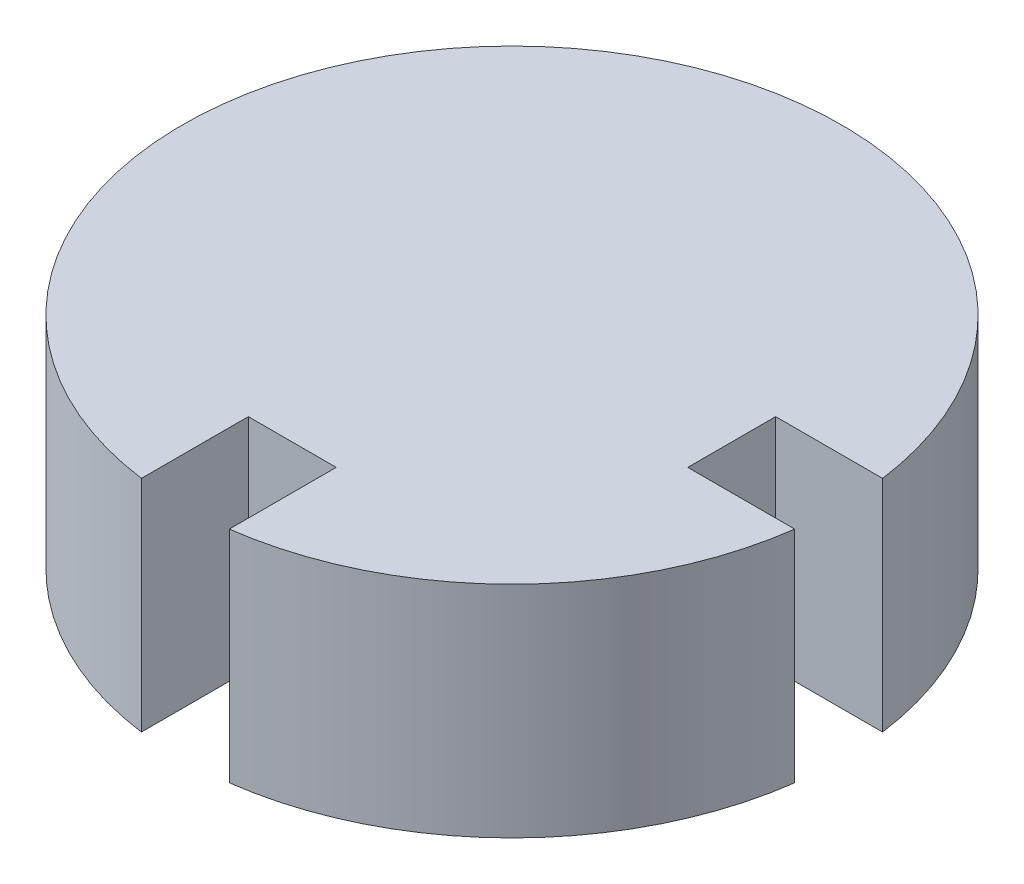
ISO-10303-21;
HEADER;
FILE_DESCRIPTION(('STEP AP214'),'2;1');
FILE_NAME('part.step','',(''),(''),'','','');
FILE_SCHEMA(('AUTOMOTIVE_DESIGN { 1 0 10303 214 1 1 1 1 }'));
ENDSEC;
DATA;
#1=APPLICATION_CONTEXT('core data for automotive mechanical design processes');
#2=APPLICATION_PROTOCOL_DEFINITION('international standard','automotive_design',2000,#1);
#3=PRODUCT_CONTEXT('',#1,'mechanical');
#4=PRODUCT('Part','Part','',(#3));
#5=PRODUCT_RELATED_PRODUCT_CATEGORY('part','',(#4));
#6=PRODUCT_DEFINITION_FORMATION('','',#4);
#7=PRODUCT_DEFINITION_CONTEXT('part definition',#1,'design');
#8=PRODUCT_DEFINITION('design','',#6,#7);
#9=PRODUCT_DEFINITION_SHAPE('','',#8);
#10=(LENGTH_UNIT() NAMED_UNIT(*) SI_UNIT(.MILLI.,.METRE.));
#11=(NAMED_UNIT(*) PLANE_ANGLE_UNIT() SI_UNIT($,.RADIAN.));
#12=(NAMED_UNIT(*) SI_UNIT($,.STERADIAN.) SOLID_ANGLE_UNIT());
#13=UNCERTAINTY_MEASURE_WITH_UNIT(LENGTH_MEASURE(1.E-05),#10,'distance_accuracy_value','');
#14=(GEOMETRIC_REPRESENTATION_CONTEXT(3) GLOBAL_UNCERTAINTY_ASSIGNED_CONTEXT((#13)) GLOBAL_UNIT_ASSIGNED_CONTEXT((#10,
#11,#12)) REPRESENTATION_CONTEXT('',''));
#15=CARTESIAN_POINT('',(0.,0.,0.));
#16=DIRECTION('',(0.,0.,1.));
#17=DIRECTION('',(1.,0.,0.));
#18=AXIS2_PLACEMENT_3D('',#15,#16,#17);
#19=CARTESIAN_POINT('',(0.4,2.,0.));
#20=DIRECTION('',(-1.,0.,0.));
#21=DIRECTION('',(0.,0.,1.));
#22=AXIS2_PLACEMENT_3D('',#19,#20,#21);
#23=PLANE('',#22);
#24=DIRECTION('',(0.,0.,-1.));
#25=VECTOR('',#24,1.);
#26=CARTESIAN_POINT('',(0.4,0.,0.));
#27=LINE('',#26,#25);
#28=CARTESIAN_POINT('',(0.4,0.,2.9732137494637));
#29=VERTEX_POINT('',#28);
#30=CARTESIAN_POINT('',(0.4,0.,2.));
#31=VERTEX_POINT('',#30);
#32=EDGE_CURVE('E140',#29,#31,#27,.T.);
#33=ORIENTED_EDGE('',*,*,#32,.F.);
#34=DIRECTION('',(0.,-1.,0.));
#35=VECTOR('',#34,1.);
#36=CARTESIAN_POINT('',(0.4,2.,2.9732137494637));
#37=LINE('',#36,#35);
#38=CARTESIAN_POINT('',(0.4,2.,2.9732137494637));
#39=VERTEX_POINT('',#38);
#40=EDGE_CURVE('E11',#39,#29,#37,.T.);
#41=ORIENTED_EDGE('',*,*,#40,.F.);
#42=DIRECTION('',(0.,0.,-1.));
#43=VECTOR('',#42,1.);
#44=CARTESIAN_POINT('',(0.4,2.,0.));
#45=LINE('',#44,#43);
#46=CARTESIAN_POINT('',(0.4,2.,2.));
#47=VERTEX_POINT('',#46);
#48=EDGE_CURVE('E163',#39,#47,#45,.T.);
#49=ORIENTED_EDGE('',*,*,#48,.T.);
#50=DIRECTION('',(0.,-1.,0.));
#51=VECTOR('',#50,1.);
#52=CARTESIAN_POINT('',(0.4,2.,2.));
#53=LINE('',#52,#51);
#54=EDGE_CURVE('E93',#47,#31,#53,.T.);
#55=ORIENTED_EDGE('',*,*,#54,.T.);
#56=EDGE_LOOP('',(#33,#41,#49,#55));
#57=FACE_BOUND('',#56,.T.);
#58=ADVANCED_FACE('F41',(#57),#23,.T.);
#59=CARTESIAN_POINT('',(0.,2.,0.));
#60=DIRECTION('',(0.,-1.,0.));
#61=DIRECTION('',(0.,0.,-1.));
#62=AXIS2_PLACEMENT_3D('',#59,#60,#61);
#63=CYLINDRICAL_SURFACE('',#62,3.);
#64=CARTESIAN_POINT('',(0.,0.,0.));
#65=DIRECTION('',(0.,1.,0.));
#66=DIRECTION('',(0.,0.,1.));
#67=AXIS2_PLACEMENT_3D('',#64,#65,#66);
#68=CIRCLE('',#67,3.);
#69=CARTESIAN_POINT('',(2.9732137494637,0.,0.4));
#70=VERTEX_POINT('',#69);
#71=EDGE_CURVE('E144',#29,#70,#68,.T.);
#72=ORIENTED_EDGE('',*,*,#71,.T.);
#73=DIRECTION('',(0.,-1.,0.));
#74=VECTOR('',#73,1.);
#75=CARTESIAN_POINT('',(2.9732137494637,2.,0.4));
#76=LINE('',#75,#74);
#77=CARTESIAN_POINT('',(2.9732137494637,2.,0.4));
#78=VERTEX_POINT('',#77);
#79=EDGE_CURVE('E50',#78,#70,#76,.T.);
#80=ORIENTED_EDGE('',*,*,#79,.F.);
#81=CARTESIAN_POINT('',(0.,2.,0.));
#82=DIRECTION('',(0.,1.,0.));
#83=DIRECTION('',(0.,0.,1.));
#84=AXIS2_PLACEMENT_3D('',#81,#82,#83);
#85=CIRCLE('',#84,3.);
#86=EDGE_CURVE('E123',#39,#78,#85,.T.);
#87=ORIENTED_EDGE('',*,*,#86,.F.);
#88=ORIENTED_EDGE('',*,*,#40,.T.);
#89=EDGE_LOOP('',(#72,#80,#87,#88));
#90=FACE_BOUND('',#89,.T.);
#91=ADVANCED_FACE('F203',(#90),#63,.T.);
#92=CARTESIAN_POINT('',(0.,2.,0.4));
#93=DIRECTION('',(0.,0.,1.));
#94=DIRECTION('',(1.,0.,0.));
#95=AXIS2_PLACEMENT_3D('',#92,#93,#94);
#96=PLANE('',#95);
#97=DIRECTION('',(-1.,0.,0.));
#98=VECTOR('',#97,1.);
#99=CARTESIAN_POINT('',(0.,0.,0.4));
#100=LINE('',#99,#98);
#101=CARTESIAN_POINT('',(2.,0.,0.4));
#102=VERTEX_POINT('',#101);
#103=EDGE_CURVE('E147',#70,#102,#100,.T.);
#104=ORIENTED_EDGE('',*,*,#103,.T.);
#105=DIRECTION('',(0.,-1.,0.));
#106=VECTOR('',#105,1.);
#107=CARTESIAN_POINT('',(2.,2.,0.4));
#108=LINE('',#107,#106);
#109=CARTESIAN_POINT('',(2.,2.,0.4));
#110=VERTEX_POINT('',#109);
#111=EDGE_CURVE('E173',#110,#102,#108,.T.);
#112=ORIENTED_EDGE('',*,*,#111,.F.);
#113=DIRECTION('',(-1.,0.,0.));
#114=VECTOR('',#113,1.);
#115=CARTESIAN_POINT('',(0.,2.,0.4));
#116=LINE('',#115,#114);
#117=EDGE_CURVE('E184',#78,#110,#116,.T.);
#118=ORIENTED_EDGE('',*,*,#117,.F.);
#119=ORIENTED_EDGE('',*,*,#79,.T.);
#120=EDGE_LOOP('',(#104,#112,#118,#119));
#121=FACE_BOUND('',#120,.T.);
#122=ADVANCED_FACE('F182',(#121),#96,.F.);
#123=CARTESIAN_POINT('',(2.,2.,0.));
#124=DIRECTION('',(-1.,0.,0.));
#125=DIRECTION('',(0.,0.,1.));
#126=AXIS2_PLACEMENT_3D('',#123,#124,#125);
#127=PLANE('',#126);
#128=DIRECTION('',(0.,0.,-1.));
#129=VECTOR('',#128,1.);
#130=CARTESIAN_POINT('',(2.,0.,0.));
#131=LINE('',#130,#129);
#132=CARTESIAN_POINT('',(2.,0.,-0.4));
#133=VERTEX_POINT('',#132);
#134=EDGE_CURVE('E150',#102,#133,#131,.T.);
#135=ORIENTED_EDGE('',*,*,#134,.T.);
#136=DIRECTION('',(0.,-1.,0.));
#137=VECTOR('',#136,1.);
#138=CARTESIAN_POINT('',(2.,2.,-0.4));
#139=LINE('',#138,#137);
#140=CARTESIAN_POINT('',(2.,2.,-0.4));
#141=VERTEX_POINT('',#140);
#142=EDGE_CURVE('E170',#141,#133,#139,.T.);
#143=ORIENTED_EDGE('',*,*,#142,.F.);
#144=DIRECTION('',(0.,0.,-1.));
#145=VECTOR('',#144,1.);
#146=CARTESIAN_POINT('',(2.,2.,0.));
#147=LINE('',#146,#145);
#148=EDGE_CURVE('E195',#110,#141,#147,.T.);
#149=ORIENTED_EDGE('',*,*,#148,.F.);
#150=ORIENTED_EDGE('',*,*,#111,.T.);
#151=EDGE_LOOP('',(#135,#143,#149,#150));
#152=FACE_BOUND('',#151,.T.);
#153=ADVANCED_FACE('F193',(#152),#127,.F.);
#154=CARTESIAN_POINT('',(0.,2.,-0.399999999999999));
#155=DIRECTION('',(0.,0.,1.));
#156=DIRECTION('',(1.,0.,0.));
#157=AXIS2_PLACEMENT_3D('',#154,#155,#156);
#158=PLANE('',#157);
#159=DIRECTION('',(-1.,0.,0.));
#160=VECTOR('',#159,1.);
#161=CARTESIAN_POINT('',(0.,0.,-0.399999999999999));
#162=LINE('',#161,#160);
#163=CARTESIAN_POINT('',(2.9732137494637,0.,-0.4));
#164=VERTEX_POINT('',#163);
#165=EDGE_CURVE('E154',#164,#133,#162,.T.);
#166=ORIENTED_EDGE('',*,*,#165,.F.);
#167=DIRECTION('',(0.,-1.,0.));
#168=VECTOR('',#167,1.);
#169=CARTESIAN_POINT('',(2.9732137494637,2.,-0.4));
#170=LINE('',#169,#168);
#171=CARTESIAN_POINT('',(2.9732137494637,2.,-0.4));
#172=VERTEX_POINT('',#171);
#173=EDGE_CURVE('E129',#172,#164,#170,.T.);
#174=ORIENTED_EDGE('',*,*,#173,.F.);
#175=DIRECTION('',(-1.,0.,0.));
#176=VECTOR('',#175,1.);
#177=CARTESIAN_POINT('',(0.,2.,-0.399999999999999));
#178=LINE('',#177,#176);
#179=EDGE_CURVE('E119',#172,#141,#178,.T.);
#180=ORIENTED_EDGE('',*,*,#179,.T.);
#181=ORIENTED_EDGE('',*,*,#142,.T.);
#182=EDGE_LOOP('',(#166,#174,#180,#181));
#183=FACE_BOUND('',#182,.T.);
#184=ADVANCED_FACE('F213',(#183),#158,.T.);
#185=CARTESIAN_POINT('',(-0.4,0.,2.9732137494637));
#186=VERTEX_POINT('',#185);
#187=EDGE_CURVE('E127',#164,#186,#68,.T.);
#188=ORIENTED_EDGE('',*,*,#187,.T.);
#189=DIRECTION('',(0.,-1.,0.));
#190=VECTOR('',#189,1.);
#191=CARTESIAN_POINT('',(-0.4,2.,2.9732137494637));
#192=LINE('',#191,#190);
#193=CARTESIAN_POINT('',(-0.4,2.,2.9732137494637));
#194=VERTEX_POINT('',#193);
#195=EDGE_CURVE('E124',#194,#186,#192,.T.);
#196=ORIENTED_EDGE('',*,*,#195,.F.);
#197=EDGE_CURVE('E113',#172,#194,#85,.T.);
#198=ORIENTED_EDGE('',*,*,#197,.F.);
#199=ORIENTED_EDGE('',*,*,#173,.T.);
#200=EDGE_LOOP('',(#188,#196,#198,#199));
#201=FACE_BOUND('',#200,.T.);
#202=ADVANCED_FACE('F125',(#201),#63,.T.);
#203=CARTESIAN_POINT('',(-0.4,2.,0.));
#204=DIRECTION('',(-1.,0.,0.));
#205=DIRECTION('',(0.,0.,1.));
#206=AXIS2_PLACEMENT_3D('',#203,#204,#205);
#207=PLANE('',#206);
#208=DIRECTION('',(0.,0.,-1.));
#209=VECTOR('',#208,1.);
#210=CARTESIAN_POINT('',(-0.4,0.,0.));
#211=LINE('',#210,#209);
#212=CARTESIAN_POINT('',(-0.4,0.,2.));
#213=VERTEX_POINT('',#212);
#214=EDGE_CURVE('E86',#186,#213,#211,.T.);
#215=ORIENTED_EDGE('',*,*,#214,.T.);
#216=DIRECTION('',(0.,-1.,0.));
#217=VECTOR('',#216,1.);
#218=CARTESIAN_POINT('',(-0.4,2.,2.));
#219=LINE('',#218,#217);
#220=CARTESIAN_POINT('',(-0.4,2.,2.));
#221=VERTEX_POINT('',#220);
#222=EDGE_CURVE('E130',#221,#213,#219,.T.);
#223=ORIENTED_EDGE('',*,*,#222,.F.);
#224=DIRECTION('',(0.,0.,-1.));
#225=VECTOR('',#224,1.);
#226=CARTESIAN_POINT('',(-0.4,2.,0.));
#227=LINE('',#226,#225);
#228=EDGE_CURVE('E117',#194,#221,#227,.T.);
#229=ORIENTED_EDGE('',*,*,#228,.F.);
#230=ORIENTED_EDGE('',*,*,#195,.T.);
#231=EDGE_LOOP('',(#215,#223,#229,#230));
#232=FACE_BOUND('',#231,.T.);
#233=ADVANCED_FACE('F132',(#232),#207,.F.);
#234=CARTESIAN_POINT('',(0.,2.,2.));
#235=DIRECTION('',(0.,0.,-1.));
#236=DIRECTION('',(-1.,0.,0.));
#237=AXIS2_PLACEMENT_3D('',#234,#235,#236);
#238=PLANE('',#237);
#239=DIRECTION('',(1.,0.,0.));
#240=VECTOR('',#239,1.);
#241=CARTESIAN_POINT('',(0.,0.,2.));
#242=LINE('',#241,#240);
#243=EDGE_CURVE('E160',#213,#31,#242,.T.);
#244=ORIENTED_EDGE('',*,*,#243,.T.);
#245=ORIENTED_EDGE('',*,*,#54,.F.);
#246=DIRECTION('',(1.,0.,0.));
#247=VECTOR('',#246,1.);
#248=CARTESIAN_POINT('',(0.,2.,2.));
#249=LINE('',#248,#247);
#250=EDGE_CURVE('E58',#221,#47,#249,.T.);
#251=ORIENTED_EDGE('',*,*,#250,.F.);
#252=ORIENTED_EDGE('',*,*,#222,.T.);
#253=EDGE_LOOP('',(#244,#245,#251,#252));
#254=FACE_BOUND('',#253,.T.);
#255=ADVANCED_FACE('F218',(#254),#238,.F.);
#256=CARTESIAN_POINT('',(0.,2.,0.));
#257=DIRECTION('',(0.,1.,0.));
#258=DIRECTION('',(0.,0.,1.));
#259=AXIS2_PLACEMENT_3D('',#256,#257,#258);
#260=PLANE('',#259);
#261=ORIENTED_EDGE('',*,*,#48,.F.);
#262=ORIENTED_EDGE('',*,*,#86,.T.);
#263=ORIENTED_EDGE('',*,*,#117,.T.);
#264=ORIENTED_EDGE('',*,*,#148,.T.);
#265=ORIENTED_EDGE('',*,*,#179,.F.);
#266=ORIENTED_EDGE('',*,*,#197,.T.);
#267=ORIENTED_EDGE('',*,*,#228,.T.);
#268=ORIENTED_EDGE('',*,*,#250,.T.);
#269=EDGE_LOOP('',(#261,#262,#263,#264,#265,#266,#267,#268));
#270=FACE_BOUND('',#269,.T.);
#271=ADVANCED_FACE('F115',(#270),#260,.T.);
#272=CARTESIAN_POINT('',(0.,0.,0.));
#273=DIRECTION('',(0.,1.,0.));
#274=DIRECTION('',(0.,0.,1.));
#275=AXIS2_PLACEMENT_3D('',#272,#273,#274);
#276=PLANE('',#275);
#277=ORIENTED_EDGE('',*,*,#32,.T.);
#278=ORIENTED_EDGE('',*,*,#243,.F.);
#279=ORIENTED_EDGE('',*,*,#214,.F.);
#280=ORIENTED_EDGE('',*,*,#187,.F.);
#281=ORIENTED_EDGE('',*,*,#165,.T.);
#282=ORIENTED_EDGE('',*,*,#134,.F.);
#283=ORIENTED_EDGE('',*,*,#103,.F.);
#284=ORIENTED_EDGE('',*,*,#71,.F.);
#285=EDGE_LOOP('',(#277,#278,#279,#280,#281,#282,#283,#284));
#286=FACE_BOUND('',#285,.T.);
#287=ADVANCED_FACE('F189',(#286),#276,.F.);
#288=CLOSED_SHELL('',(#58,#91,#122,#153,#184,#202,#233,#255,#271,#287));
#289=MANIFOLD_SOLID_BREP('B2',#288);
#290=ADVANCED_BREP_SHAPE_REPRESENTATION('',(#18,#289),#14);
#291=SHAPE_DEFINITION_REPRESENTATION(#9,#290);
ENDSEC;
END-ISO-10303-21;
